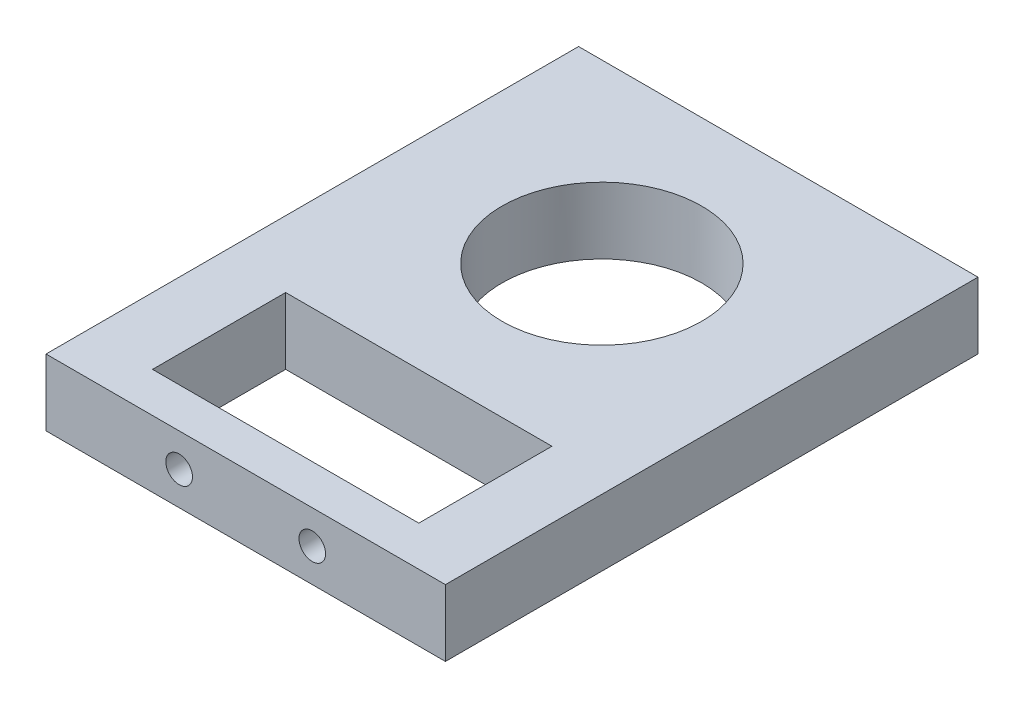
ISO-10303-21;
HEADER;
FILE_DESCRIPTION(('STEP AP214'),'2;1');
FILE_NAME('part.step','',(''),(''),'','','');
FILE_SCHEMA(('AUTOMOTIVE_DESIGN { 1 0 10303 214 1 1 1 1 }'));
ENDSEC;
DATA;
#1=APPLICATION_CONTEXT('core data for automotive mechanical design processes');
#2=APPLICATION_PROTOCOL_DEFINITION('international standard','automotive_design',2000,#1);
#3=PRODUCT_CONTEXT('',#1,'mechanical');
#4=PRODUCT('Part','Part','',(#3));
#5=PRODUCT_RELATED_PRODUCT_CATEGORY('part','',(#4));
#6=PRODUCT_DEFINITION_FORMATION('','',#4);
#7=PRODUCT_DEFINITION_CONTEXT('part definition',#1,'design');
#8=PRODUCT_DEFINITION('design','',#6,#7);
#9=PRODUCT_DEFINITION_SHAPE('','',#8);
#10=(LENGTH_UNIT() NAMED_UNIT(*) SI_UNIT(.MILLI.,.METRE.));
#11=(NAMED_UNIT(*) PLANE_ANGLE_UNIT() SI_UNIT($,.RADIAN.));
#12=(NAMED_UNIT(*) SI_UNIT($,.STERADIAN.) SOLID_ANGLE_UNIT());
#13=UNCERTAINTY_MEASURE_WITH_UNIT(LENGTH_MEASURE(1.E-05),#10,'distance_accuracy_value','');
#14=(GEOMETRIC_REPRESENTATION_CONTEXT(3) GLOBAL_UNCERTAINTY_ASSIGNED_CONTEXT((#13)) GLOBAL_UNIT_ASSIGNED_CONTEXT((#10,
#11,#12)) REPRESENTATION_CONTEXT('',''));
#15=CARTESIAN_POINT('',(0.,0.,0.));
#16=DIRECTION('',(0.,0.,1.));
#17=DIRECTION('',(1.,0.,0.));
#18=AXIS2_PLACEMENT_3D('',#15,#16,#17);
#19=CARTESIAN_POINT('',(30.,10.,40.));
#20=DIRECTION('',(-1.,0.,0.));
#21=DIRECTION('',(0.,0.,1.));
#22=AXIS2_PLACEMENT_3D('',#19,#20,#21);
#23=PLANE('',#22);
#24=DIRECTION('',(0.,0.,-1.));
#25=VECTOR('',#24,1.);
#26=CARTESIAN_POINT('',(30.,0.,40.));
#27=LINE('',#26,#25);
#28=CARTESIAN_POINT('',(30.,0.,40.));
#29=VERTEX_POINT('',#28);
#30=CARTESIAN_POINT('',(30.,0.,-40.));
#31=VERTEX_POINT('',#30);
#32=EDGE_CURVE('E143',#29,#31,#27,.T.);
#33=ORIENTED_EDGE('',*,*,#32,.T.);
#34=DIRECTION('',(0.,-1.,0.));
#35=VECTOR('',#34,1.);
#36=CARTESIAN_POINT('',(30.,10.,-40.));
#37=LINE('',#36,#35);
#38=CARTESIAN_POINT('',(30.,10.,-40.));
#39=VERTEX_POINT('',#38);
#40=EDGE_CURVE('E159',#39,#31,#37,.T.);
#41=ORIENTED_EDGE('',*,*,#40,.F.);
#42=DIRECTION('',(0.,0.,-1.));
#43=VECTOR('',#42,1.);
#44=CARTESIAN_POINT('',(30.,10.,40.));
#45=LINE('',#44,#43);
#46=CARTESIAN_POINT('',(30.,10.,40.));
#47=VERTEX_POINT('',#46);
#48=EDGE_CURVE('E132',#47,#39,#45,.T.);
#49=ORIENTED_EDGE('',*,*,#48,.F.);
#50=DIRECTION('',(0.,-1.,0.));
#51=VECTOR('',#50,1.);
#52=CARTESIAN_POINT('',(30.,10.,40.));
#53=LINE('',#52,#51);
#54=EDGE_CURVE('E142',#47,#29,#53,.T.);
#55=ORIENTED_EDGE('',*,*,#54,.T.);
#56=EDGE_LOOP('',(#33,#41,#49,#55));
#57=FACE_BOUND('',#56,.T.);
#58=ADVANCED_FACE('F37',(#57),#23,.F.);
#59=CARTESIAN_POINT('',(-30.,10.,-40.));
#60=DIRECTION('',(0.,0.,1.));
#61=DIRECTION('',(1.,0.,0.));
#62=AXIS2_PLACEMENT_3D('',#59,#60,#61);
#63=PLANE('',#62);
#64=DIRECTION('',(-1.,0.,0.));
#65=VECTOR('',#64,1.);
#66=CARTESIAN_POINT('',(-30.,0.,-40.));
#67=LINE('',#66,#65);
#68=CARTESIAN_POINT('',(-30.,0.,-40.));
#69=VERTEX_POINT('',#68);
#70=EDGE_CURVE('E146',#31,#69,#67,.T.);
#71=ORIENTED_EDGE('',*,*,#70,.T.);
#72=DIRECTION('',(0.,-1.,0.));
#73=VECTOR('',#72,1.);
#74=CARTESIAN_POINT('',(-30.,10.,-40.));
#75=LINE('',#74,#73);
#76=CARTESIAN_POINT('',(-30.,10.,-40.));
#77=VERTEX_POINT('',#76);
#78=EDGE_CURVE('E156',#77,#69,#75,.T.);
#79=ORIENTED_EDGE('',*,*,#78,.F.);
#80=DIRECTION('',(-1.,0.,0.));
#81=VECTOR('',#80,1.);
#82=CARTESIAN_POINT('',(-30.,10.,-40.));
#83=LINE('',#82,#81);
#84=EDGE_CURVE('E135',#39,#77,#83,.T.);
#85=ORIENTED_EDGE('',*,*,#84,.F.);
#86=ORIENTED_EDGE('',*,*,#40,.T.);
#87=EDGE_LOOP('',(#71,#79,#85,#86));
#88=FACE_BOUND('',#87,.T.);
#89=ADVANCED_FACE('F221',(#88),#63,.F.);
#90=CARTESIAN_POINT('',(-30.,10.,40.));
#91=DIRECTION('',(1.,0.,0.));
#92=DIRECTION('',(0.,0.,-1.));
#93=AXIS2_PLACEMENT_3D('',#90,#91,#92);
#94=PLANE('',#93);
#95=DIRECTION('',(0.,0.,1.));
#96=VECTOR('',#95,1.);
#97=CARTESIAN_POINT('',(-30.,0.,40.));
#98=LINE('',#97,#96);
#99=CARTESIAN_POINT('',(-30.,0.,40.));
#100=VERTEX_POINT('',#99);
#101=EDGE_CURVE('E148',#69,#100,#98,.T.);
#102=ORIENTED_EDGE('',*,*,#101,.T.);
#103=DIRECTION('',(0.,-1.,0.));
#104=VECTOR('',#103,1.);
#105=CARTESIAN_POINT('',(-30.,10.,40.));
#106=LINE('',#105,#104);
#107=CARTESIAN_POINT('',(-30.,10.,40.));
#108=VERTEX_POINT('',#107);
#109=EDGE_CURVE('E153',#108,#100,#106,.T.);
#110=ORIENTED_EDGE('',*,*,#109,.F.);
#111=DIRECTION('',(0.,0.,1.));
#112=VECTOR('',#111,1.);
#113=CARTESIAN_POINT('',(-30.,10.,40.));
#114=LINE('',#113,#112);
#115=EDGE_CURVE('E138',#77,#108,#114,.T.);
#116=ORIENTED_EDGE('',*,*,#115,.F.);
#117=ORIENTED_EDGE('',*,*,#78,.T.);
#118=EDGE_LOOP('',(#102,#110,#116,#117));
#119=FACE_BOUND('',#118,.T.);
#120=ADVANCED_FACE('F206',(#119),#94,.F.);
#121=CARTESIAN_POINT('',(-30.,10.,40.));
#122=DIRECTION('',(0.,0.,-1.));
#123=DIRECTION('',(-1.,0.,0.));
#124=AXIS2_PLACEMENT_3D('',#121,#122,#123);
#125=PLANE('',#124);
#126=CARTESIAN_POINT('',(-10.,5.,40.));
#127=DIRECTION('',(0.,0.,-1.));
#128=DIRECTION('',(-1.,0.,0.));
#129=AXIS2_PLACEMENT_3D('',#126,#127,#128);
#130=CIRCLE('',#129,2.);
#131=CARTESIAN_POINT('',(-12.,5.,40.));
#132=VERTEX_POINT('',#131);
#133=EDGE_CURVE('E175',#132,#132,#130,.T.);
#134=ORIENTED_EDGE('',*,*,#133,.T.);
#135=EDGE_LOOP('',(#134));
#136=FACE_BOUND('',#135,.T.);
#137=CARTESIAN_POINT('',(10.,5.,40.));
#138=DIRECTION('',(0.,0.,-1.));
#139=DIRECTION('',(-1.,0.,0.));
#140=AXIS2_PLACEMENT_3D('',#137,#138,#139);
#141=CIRCLE('',#140,2.);
#142=CARTESIAN_POINT('',(8.,5.,40.));
#143=VERTEX_POINT('',#142);
#144=EDGE_CURVE('E177',#143,#143,#141,.T.);
#145=ORIENTED_EDGE('',*,*,#144,.T.);
#146=EDGE_LOOP('',(#145));
#147=FACE_BOUND('',#146,.T.);
#148=DIRECTION('',(1.,0.,0.));
#149=VECTOR('',#148,1.);
#150=CARTESIAN_POINT('',(-30.,0.,40.));
#151=LINE('',#150,#149);
#152=EDGE_CURVE('E136',#100,#29,#151,.T.);
#153=ORIENTED_EDGE('',*,*,#152,.T.);
#154=ORIENTED_EDGE('',*,*,#54,.F.);
#155=DIRECTION('',(1.,0.,0.));
#156=VECTOR('',#155,1.);
#157=CARTESIAN_POINT('',(-30.,10.,40.));
#158=LINE('',#157,#156);
#159=EDGE_CURVE('E140',#108,#47,#158,.T.);
#160=ORIENTED_EDGE('',*,*,#159,.F.);
#161=ORIENTED_EDGE('',*,*,#109,.T.);
#162=EDGE_LOOP('',(#153,#154,#160,#161));
#163=FACE_BOUND('',#162,.T.);
#164=ADVANCED_FACE('F203',(#136,#147,#163),#125,.F.);
#165=CARTESIAN_POINT('',(0.,10.,0.));
#166=DIRECTION('',(0.,-1.,0.));
#167=DIRECTION('',(0.,0.,-1.));
#168=AXIS2_PLACEMENT_3D('',#165,#166,#167);
#169=PLANE('',#168);
#170=DIRECTION('',(1.,0.,0.));
#171=VECTOR('',#170,1.);
#172=CARTESIAN_POINT('',(20.,10.,34.));
#173=LINE('',#172,#171);
#174=CARTESIAN_POINT('',(-20.,10.,34.));
#175=VERTEX_POINT('',#174);
#176=CARTESIAN_POINT('',(20.,10.,34.));
#177=VERTEX_POINT('',#176);
#178=EDGE_CURVE('E112',#175,#177,#173,.T.);
#179=ORIENTED_EDGE('',*,*,#178,.F.);
#180=DIRECTION('',(0.,0.,1.));
#181=VECTOR('',#180,1.);
#182=CARTESIAN_POINT('',(-20.,10.,34.));
#183=LINE('',#182,#181);
#184=CARTESIAN_POINT('',(-20.,10.,14.));
#185=VERTEX_POINT('',#184);
#186=EDGE_CURVE('E51',#185,#175,#183,.T.);
#187=ORIENTED_EDGE('',*,*,#186,.F.);
#188=DIRECTION('',(-1.,0.,0.));
#189=VECTOR('',#188,1.);
#190=CARTESIAN_POINT('',(20.,10.,14.));
#191=LINE('',#190,#189);
#192=CARTESIAN_POINT('',(20.,10.,14.));
#193=VERTEX_POINT('',#192);
#194=EDGE_CURVE('E119',#193,#185,#191,.T.);
#195=ORIENTED_EDGE('',*,*,#194,.F.);
#196=DIRECTION('',(0.,0.,-1.));
#197=VECTOR('',#196,1.);
#198=CARTESIAN_POINT('',(20.,10.,34.));
#199=LINE('',#198,#197);
#200=EDGE_CURVE('E103',#177,#193,#199,.T.);
#201=ORIENTED_EDGE('',*,*,#200,.F.);
#202=EDGE_LOOP('',(#179,#187,#195,#201));
#203=FACE_BOUND('',#202,.T.);
#204=CARTESIAN_POINT('',(0.,10.,-13.5));
#205=DIRECTION('',(0.,1.,0.));
#206=DIRECTION('',(0.,0.,1.));
#207=AXIS2_PLACEMENT_3D('',#204,#205,#206);
#208=CIRCLE('',#207,15.);
#209=CARTESIAN_POINT('',(0.,10.,1.49999999999999));
#210=VERTEX_POINT('',#209);
#211=EDGE_CURVE('E126',#210,#210,#208,.T.);
#212=ORIENTED_EDGE('',*,*,#211,.F.);
#213=EDGE_LOOP('',(#212));
#214=FACE_BOUND('',#213,.T.);
#215=ORIENTED_EDGE('',*,*,#48,.T.);
#216=ORIENTED_EDGE('',*,*,#84,.T.);
#217=ORIENTED_EDGE('',*,*,#115,.T.);
#218=ORIENTED_EDGE('',*,*,#159,.T.);
#219=EDGE_LOOP('',(#215,#216,#217,#218));
#220=FACE_BOUND('',#219,.T.);
#221=ADVANCED_FACE('F116',(#203,#214,#220),#169,.F.);
#222=CARTESIAN_POINT('',(0.,0.,0.));
#223=DIRECTION('',(0.,-1.,0.));
#224=DIRECTION('',(0.,0.,-1.));
#225=AXIS2_PLACEMENT_3D('',#222,#223,#224);
#226=PLANE('',#225);
#227=DIRECTION('',(0.,0.,-1.));
#228=VECTOR('',#227,1.);
#229=CARTESIAN_POINT('',(-20.,0.,0.));
#230=LINE('',#229,#228);
#231=CARTESIAN_POINT('',(-20.,0.,34.));
#232=VERTEX_POINT('',#231);
#233=CARTESIAN_POINT('',(-20.,0.,14.));
#234=VERTEX_POINT('',#233);
#235=EDGE_CURVE('E11',#232,#234,#230,.T.);
#236=ORIENTED_EDGE('',*,*,#235,.F.);
#237=DIRECTION('',(-1.,0.,0.));
#238=VECTOR('',#237,1.);
#239=CARTESIAN_POINT('',(0.,0.,34.));
#240=LINE('',#239,#238);
#241=CARTESIAN_POINT('',(20.,0.,34.));
#242=VERTEX_POINT('',#241);
#243=EDGE_CURVE('E162',#242,#232,#240,.T.);
#244=ORIENTED_EDGE('',*,*,#243,.F.);
#245=DIRECTION('',(0.,0.,1.));
#246=VECTOR('',#245,1.);
#247=CARTESIAN_POINT('',(20.,0.,0.));
#248=LINE('',#247,#246);
#249=CARTESIAN_POINT('',(20.,0.,14.));
#250=VERTEX_POINT('',#249);
#251=EDGE_CURVE('E106',#250,#242,#248,.T.);
#252=ORIENTED_EDGE('',*,*,#251,.F.);
#253=DIRECTION('',(1.,0.,0.));
#254=VECTOR('',#253,1.);
#255=CARTESIAN_POINT('',(0.,0.,14.));
#256=LINE('',#255,#254);
#257=EDGE_CURVE('E44',#234,#250,#256,.T.);
#258=ORIENTED_EDGE('',*,*,#257,.F.);
#259=EDGE_LOOP('',(#236,#244,#252,#258));
#260=FACE_BOUND('',#259,.T.);
#261=CARTESIAN_POINT('',(0.,0.,-13.5));
#262=DIRECTION('',(0.,-1.,0.));
#263=DIRECTION('',(0.,0.,-1.));
#264=AXIS2_PLACEMENT_3D('',#261,#262,#263);
#265=CIRCLE('',#264,15.);
#266=CARTESIAN_POINT('',(0.,0.,-28.5));
#267=VERTEX_POINT('',#266);
#268=EDGE_CURVE('E131',#267,#267,#265,.T.);
#269=ORIENTED_EDGE('',*,*,#268,.F.);
#270=EDGE_LOOP('',(#269));
#271=FACE_BOUND('',#270,.T.);
#272=ORIENTED_EDGE('',*,*,#32,.F.);
#273=ORIENTED_EDGE('',*,*,#152,.F.);
#274=ORIENTED_EDGE('',*,*,#101,.F.);
#275=ORIENTED_EDGE('',*,*,#70,.F.);
#276=EDGE_LOOP('',(#272,#273,#274,#275));
#277=FACE_BOUND('',#276,.T.);
#278=ADVANCED_FACE('F172',(#260,#271,#277),#226,.T.);
#279=CARTESIAN_POINT('',(0.,-70.,-13.5));
#280=DIRECTION('',(0.,1.,0.));
#281=DIRECTION('',(0.,0.,1.));
#282=AXIS2_PLACEMENT_3D('',#279,#280,#281);
#283=CYLINDRICAL_SURFACE('',#282,15.);
#284=ORIENTED_EDGE('',*,*,#268,.T.);
#285=EDGE_LOOP('',(#284));
#286=FACE_BOUND('',#285,.T.);
#287=ORIENTED_EDGE('',*,*,#211,.T.);
#288=EDGE_LOOP('',(#287));
#289=FACE_BOUND('',#288,.T.);
#290=ADVANCED_FACE('F249',(#286,#289),#283,.F.);
#291=CARTESIAN_POINT('',(-20.,-70.,34.));
#292=DIRECTION('',(-1.,0.,0.));
#293=DIRECTION('',(0.,0.,1.));
#294=AXIS2_PLACEMENT_3D('',#291,#292,#293);
#295=PLANE('',#294);
#296=ORIENTED_EDGE('',*,*,#235,.T.);
#297=DIRECTION('',(0.,1.,0.));
#298=VECTOR('',#297,1.);
#299=CARTESIAN_POINT('',(-20.,-70.,14.));
#300=LINE('',#299,#298);
#301=EDGE_CURVE('E124',#234,#185,#300,.T.);
#302=ORIENTED_EDGE('',*,*,#301,.T.);
#303=ORIENTED_EDGE('',*,*,#186,.T.);
#304=DIRECTION('',(0.,1.,0.));
#305=VECTOR('',#304,1.);
#306=CARTESIAN_POINT('',(-20.,-70.,34.));
#307=LINE('',#306,#305);
#308=EDGE_CURVE('E109',#232,#175,#307,.T.);
#309=ORIENTED_EDGE('',*,*,#308,.F.);
#310=EDGE_LOOP('',(#296,#302,#303,#309));
#311=FACE_BOUND('',#310,.T.);
#312=ADVANCED_FACE('F174',(#311),#295,.F.);
#313=CARTESIAN_POINT('',(20.,-70.,14.));
#314=DIRECTION('',(0.,0.,-1.));
#315=DIRECTION('',(-1.,0.,0.));
#316=AXIS2_PLACEMENT_3D('',#313,#314,#315);
#317=PLANE('',#316);
#318=ORIENTED_EDGE('',*,*,#257,.T.);
#319=DIRECTION('',(0.,1.,0.));
#320=VECTOR('',#319,1.);
#321=CARTESIAN_POINT('',(20.,-70.,14.));
#322=LINE('',#321,#320);
#323=EDGE_CURVE('E108',#250,#193,#322,.T.);
#324=ORIENTED_EDGE('',*,*,#323,.T.);
#325=ORIENTED_EDGE('',*,*,#194,.T.);
#326=ORIENTED_EDGE('',*,*,#301,.F.);
#327=EDGE_LOOP('',(#318,#324,#325,#326));
#328=FACE_BOUND('',#327,.T.);
#329=ADVANCED_FACE('F169',(#328),#317,.F.);
#330=CARTESIAN_POINT('',(20.,-70.,34.));
#331=DIRECTION('',(1.,0.,0.));
#332=DIRECTION('',(0.,0.,-1.));
#333=AXIS2_PLACEMENT_3D('',#330,#331,#332);
#334=PLANE('',#333);
#335=ORIENTED_EDGE('',*,*,#251,.T.);
#336=DIRECTION('',(0.,1.,0.));
#337=VECTOR('',#336,1.);
#338=CARTESIAN_POINT('',(20.,-70.,34.));
#339=LINE('',#338,#337);
#340=EDGE_CURVE('E59',#242,#177,#339,.T.);
#341=ORIENTED_EDGE('',*,*,#340,.T.);
#342=ORIENTED_EDGE('',*,*,#200,.T.);
#343=ORIENTED_EDGE('',*,*,#323,.F.);
#344=EDGE_LOOP('',(#335,#341,#342,#343));
#345=FACE_BOUND('',#344,.T.);
#346=ADVANCED_FACE('F100',(#345),#334,.F.);
#347=CARTESIAN_POINT('',(20.,-70.,34.));
#348=DIRECTION('',(0.,0.,1.));
#349=DIRECTION('',(1.,0.,0.));
#350=AXIS2_PLACEMENT_3D('',#347,#348,#349);
#351=PLANE('',#350);
#352=CARTESIAN_POINT('',(-10.,5.,34.));
#353=DIRECTION('',(0.,0.,-1.));
#354=DIRECTION('',(-1.,0.,0.));
#355=AXIS2_PLACEMENT_3D('',#352,#353,#354);
#356=CIRCLE('',#355,2.);
#357=CARTESIAN_POINT('',(-12.,5.,34.));
#358=VERTEX_POINT('',#357);
#359=EDGE_CURVE('E182',#358,#358,#356,.T.);
#360=ORIENTED_EDGE('',*,*,#359,.F.);
#361=EDGE_LOOP('',(#360));
#362=FACE_BOUND('',#361,.T.);
#363=CARTESIAN_POINT('',(10.,5.,34.));
#364=DIRECTION('',(0.,0.,-1.));
#365=DIRECTION('',(1.,0.,0.));
#366=AXIS2_PLACEMENT_3D('',#363,#364,#365);
#367=CIRCLE('',#366,2.);
#368=CARTESIAN_POINT('',(12.,5.,34.));
#369=VERTEX_POINT('',#368);
#370=EDGE_CURVE('E183',#369,#369,#367,.T.);
#371=ORIENTED_EDGE('',*,*,#370,.F.);
#372=EDGE_LOOP('',(#371));
#373=FACE_BOUND('',#372,.T.);
#374=ORIENTED_EDGE('',*,*,#243,.T.);
#375=ORIENTED_EDGE('',*,*,#308,.T.);
#376=ORIENTED_EDGE('',*,*,#178,.T.);
#377=ORIENTED_EDGE('',*,*,#340,.F.);
#378=EDGE_LOOP('',(#374,#375,#376,#377));
#379=FACE_BOUND('',#378,.T.);
#380=ADVANCED_FACE('F113',(#362,#373,#379),#351,.F.);
#381=CARTESIAN_POINT('',(10.,5.,44.));
#382=DIRECTION('',(0.,0.,-1.));
#383=DIRECTION('',(-1.,0.,0.));
#384=AXIS2_PLACEMENT_3D('',#381,#382,#383);
#385=CYLINDRICAL_SURFACE('',#384,2.);
#386=ORIENTED_EDGE('',*,*,#370,.T.);
#387=EDGE_LOOP('',(#386));
#388=FACE_BOUND('',#387,.T.);
#389=ORIENTED_EDGE('',*,*,#144,.F.);
#390=EDGE_LOOP('',(#389));
#391=FACE_BOUND('',#390,.T.);
#392=ADVANCED_FACE('F194',(#388,#391),#385,.F.);
#393=CARTESIAN_POINT('',(-10.,5.,44.));
#394=DIRECTION('',(0.,0.,-1.));
#395=DIRECTION('',(-1.,0.,0.));
#396=AXIS2_PLACEMENT_3D('',#393,#394,#395);
#397=CYLINDRICAL_SURFACE('',#396,2.);
#398=ORIENTED_EDGE('',*,*,#359,.T.);
#399=EDGE_LOOP('',(#398));
#400=FACE_BOUND('',#399,.T.);
#401=ORIENTED_EDGE('',*,*,#133,.F.);
#402=EDGE_LOOP('',(#401));
#403=FACE_BOUND('',#402,.T.);
#404=ADVANCED_FACE('F189',(#400,#403),#397,.F.);
#405=CLOSED_SHELL('',(#58,#89,#120,#164,#221,#278,#290,#312,#329,#346,#380,#392,#404));
#406=MANIFOLD_SOLID_BREP('B2',#405);
#407=ADVANCED_BREP_SHAPE_REPRESENTATION('',(#18,#406),#14);
#408=SHAPE_DEFINITION_REPRESENTATION(#9,#407);
ENDSEC;
END-ISO-10303-21;
